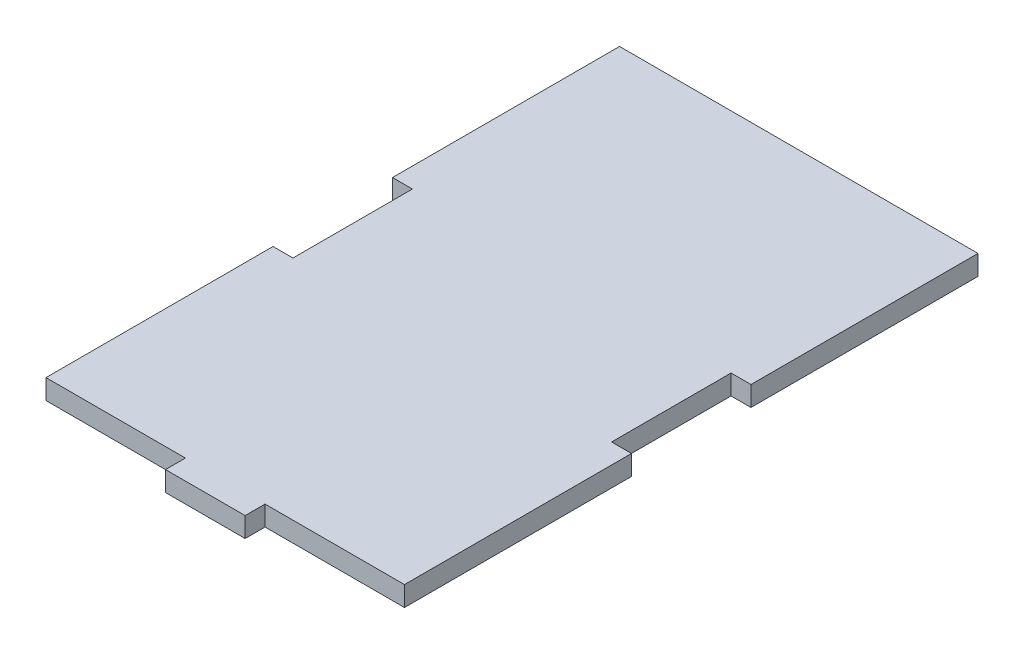
ISO-10303-21;
HEADER;
FILE_DESCRIPTION(('STEP AP214'),'2;1');
FILE_NAME('part.step','',(''),(''),'','','');
FILE_SCHEMA(('AUTOMOTIVE_DESIGN { 1 0 10303 214 1 1 1 1 }'));
ENDSEC;
DATA;
#1=APPLICATION_CONTEXT('core data for automotive mechanical design processes');
#2=APPLICATION_PROTOCOL_DEFINITION('international standard','automotive_design',2000,#1);
#3=PRODUCT_CONTEXT('',#1,'mechanical');
#4=PRODUCT('Part','Part','',(#3));
#5=PRODUCT_RELATED_PRODUCT_CATEGORY('part','',(#4));
#6=PRODUCT_DEFINITION_FORMATION('','',#4);
#7=PRODUCT_DEFINITION_CONTEXT('part definition',#1,'design');
#8=PRODUCT_DEFINITION('design','',#6,#7);
#9=PRODUCT_DEFINITION_SHAPE('','',#8);
#10=(LENGTH_UNIT() NAMED_UNIT(*) SI_UNIT(.MILLI.,.METRE.));
#11=(NAMED_UNIT(*) PLANE_ANGLE_UNIT() SI_UNIT($,.RADIAN.));
#12=(NAMED_UNIT(*) SI_UNIT($,.STERADIAN.) SOLID_ANGLE_UNIT());
#13=UNCERTAINTY_MEASURE_WITH_UNIT(LENGTH_MEASURE(1.E-05),#10,'distance_accuracy_value','');
#14=(GEOMETRIC_REPRESENTATION_CONTEXT(3) GLOBAL_UNCERTAINTY_ASSIGNED_CONTEXT((#13)) GLOBAL_UNIT_ASSIGNED_CONTEXT((#10,
#11,#12)) REPRESENTATION_CONTEXT('',''));
#15=CARTESIAN_POINT('',(0.,0.,0.));
#16=DIRECTION('',(0.,0.,1.));
#17=DIRECTION('',(1.,0.,0.));
#18=AXIS2_PLACEMENT_3D('',#15,#16,#17);
#19=CARTESIAN_POINT('',(10.,5.,0.));
#20=DIRECTION('',(1.,0.,0.));
#21=DIRECTION('',(0.,0.,-1.));
#22=AXIS2_PLACEMENT_3D('',#19,#20,#21);
#23=PLANE('',#22);
#24=DIRECTION('',(0.,0.,1.));
#25=VECTOR('',#24,1.);
#26=CARTESIAN_POINT('',(10.,0.,0.));
#27=LINE('',#26,#25);
#28=CARTESIAN_POINT('',(10.,0.,72.));
#29=VERTEX_POINT('',#28);
#30=CARTESIAN_POINT('',(10.,0.,77.));
#31=VERTEX_POINT('',#30);
#32=EDGE_CURVE('E177',#29,#31,#27,.T.);
#33=ORIENTED_EDGE('',*,*,#32,.F.);
#34=DIRECTION('',(0.,-1.,0.));
#35=VECTOR('',#34,1.);
#36=CARTESIAN_POINT('',(10.,5.,72.));
#37=LINE('',#36,#35);
#38=CARTESIAN_POINT('',(10.,5.,72.));
#39=VERTEX_POINT('',#38);
#40=EDGE_CURVE('E11',#39,#29,#37,.T.);
#41=ORIENTED_EDGE('',*,*,#40,.F.);
#42=DIRECTION('',(0.,0.,1.));
#43=VECTOR('',#42,1.);
#44=CARTESIAN_POINT('',(10.,5.,0.));
#45=LINE('',#44,#43);
#46=CARTESIAN_POINT('',(10.,5.,77.));
#47=VERTEX_POINT('',#46);
#48=EDGE_CURVE('E216',#39,#47,#45,.T.);
#49=ORIENTED_EDGE('',*,*,#48,.T.);
#50=DIRECTION('',(0.,-1.,0.));
#51=VECTOR('',#50,1.);
#52=CARTESIAN_POINT('',(10.,5.,77.));
#53=LINE('',#52,#51);
#54=EDGE_CURVE('E51',#47,#31,#53,.T.);
#55=ORIENTED_EDGE('',*,*,#54,.T.);
#56=EDGE_LOOP('',(#33,#41,#49,#55));
#57=FACE_BOUND('',#56,.T.);
#58=ADVANCED_FACE('F35',(#57),#23,.T.);
#59=CARTESIAN_POINT('',(0.,5.,72.));
#60=DIRECTION('',(0.,0.,-1.));
#61=DIRECTION('',(-1.,0.,0.));
#62=AXIS2_PLACEMENT_3D('',#59,#60,#61);
#63=PLANE('',#62);
#64=DIRECTION('',(1.,0.,0.));
#65=VECTOR('',#64,1.);
#66=CARTESIAN_POINT('',(0.,0.,72.));
#67=LINE('',#66,#65);
#68=CARTESIAN_POINT('',(45.,0.,72.));
#69=VERTEX_POINT('',#68);
#70=EDGE_CURVE('E179',#29,#69,#67,.T.);
#71=ORIENTED_EDGE('',*,*,#70,.T.);
#72=DIRECTION('',(0.,-1.,0.));
#73=VECTOR('',#72,1.);
#74=CARTESIAN_POINT('',(45.,5.,72.));
#75=LINE('',#74,#73);
#76=CARTESIAN_POINT('',(45.,5.,72.));
#77=VERTEX_POINT('',#76);
#78=EDGE_CURVE('E43',#77,#69,#75,.T.);
#79=ORIENTED_EDGE('',*,*,#78,.F.);
#80=DIRECTION('',(1.,0.,0.));
#81=VECTOR('',#80,1.);
#82=CARTESIAN_POINT('',(0.,5.,72.));
#83=LINE('',#82,#81);
#84=EDGE_CURVE('E264',#39,#77,#83,.T.);
#85=ORIENTED_EDGE('',*,*,#84,.F.);
#86=ORIENTED_EDGE('',*,*,#40,.T.);
#87=EDGE_LOOP('',(#71,#79,#85,#86));
#88=FACE_BOUND('',#87,.T.);
#89=ADVANCED_FACE('F252',(#88),#63,.F.);
#90=CARTESIAN_POINT('',(45.,5.,0.));
#91=DIRECTION('',(1.,0.,0.));
#92=DIRECTION('',(0.,0.,-1.));
#93=AXIS2_PLACEMENT_3D('',#90,#91,#92);
#94=PLANE('',#93);
#95=DIRECTION('',(0.,0.,1.));
#96=VECTOR('',#95,1.);
#97=CARTESIAN_POINT('',(45.,0.,0.));
#98=LINE('',#97,#96);
#99=CARTESIAN_POINT('',(45.,0.,15.));
#100=VERTEX_POINT('',#99);
#101=EDGE_CURVE('E182',#100,#69,#98,.T.);
#102=ORIENTED_EDGE('',*,*,#101,.F.);
#103=DIRECTION('',(0.,-1.,0.));
#104=VECTOR('',#103,1.);
#105=CARTESIAN_POINT('',(45.,5.,15.));
#106=LINE('',#105,#104);
#107=CARTESIAN_POINT('',(45.,5.,15.));
#108=VERTEX_POINT('',#107);
#109=EDGE_CURVE('E242',#108,#100,#106,.T.);
#110=ORIENTED_EDGE('',*,*,#109,.F.);
#111=DIRECTION('',(0.,0.,1.));
#112=VECTOR('',#111,1.);
#113=CARTESIAN_POINT('',(45.,5.,0.));
#114=LINE('',#113,#112);
#115=EDGE_CURVE('E249',#108,#77,#114,.T.);
#116=ORIENTED_EDGE('',*,*,#115,.T.);
#117=ORIENTED_EDGE('',*,*,#78,.T.);
#118=EDGE_LOOP('',(#102,#110,#116,#117));
#119=FACE_BOUND('',#118,.T.);
#120=ADVANCED_FACE('F247',(#119),#94,.T.);
#121=CARTESIAN_POINT('',(0.,5.,14.9999999999999));
#122=DIRECTION('',(0.,0.,-1.));
#123=DIRECTION('',(-1.,0.,0.));
#124=AXIS2_PLACEMENT_3D('',#121,#122,#123);
#125=PLANE('',#124);
#126=DIRECTION('',(1.,0.,0.));
#127=VECTOR('',#126,1.);
#128=CARTESIAN_POINT('',(0.,0.,14.9999999999999));
#129=LINE('',#128,#127);
#130=CARTESIAN_POINT('',(40.,0.,15.));
#131=VERTEX_POINT('',#130);
#132=EDGE_CURVE('E185',#131,#100,#129,.T.);
#133=ORIENTED_EDGE('',*,*,#132,.F.);
#134=DIRECTION('',(0.,-1.,0.));
#135=VECTOR('',#134,1.);
#136=CARTESIAN_POINT('',(40.,5.,15.));
#137=LINE('',#136,#135);
#138=CARTESIAN_POINT('',(40.,5.,15.));
#139=VERTEX_POINT('',#138);
#140=EDGE_CURVE('E240',#139,#131,#137,.T.);
#141=ORIENTED_EDGE('',*,*,#140,.F.);
#142=DIRECTION('',(1.,0.,0.));
#143=VECTOR('',#142,1.);
#144=CARTESIAN_POINT('',(0.,5.,14.9999999999999));
#145=LINE('',#144,#143);
#146=EDGE_CURVE('E261',#139,#108,#145,.T.);
#147=ORIENTED_EDGE('',*,*,#146,.T.);
#148=ORIENTED_EDGE('',*,*,#109,.T.);
#149=EDGE_LOOP('',(#133,#141,#147,#148));
#150=FACE_BOUND('',#149,.T.);
#151=ADVANCED_FACE('F258',(#150),#125,.T.);
#152=CARTESIAN_POINT('',(40.,5.,0.));
#153=DIRECTION('',(1.,0.,0.));
#154=DIRECTION('',(0.,0.,-1.));
#155=AXIS2_PLACEMENT_3D('',#152,#153,#154);
#156=PLANE('',#155);
#157=DIRECTION('',(0.,0.,1.));
#158=VECTOR('',#157,1.);
#159=CARTESIAN_POINT('',(40.,0.,0.));
#160=LINE('',#159,#158);
#161=CARTESIAN_POINT('',(40.,0.,-15.));
#162=VERTEX_POINT('',#161);
#163=EDGE_CURVE('E188',#162,#131,#160,.T.);
#164=ORIENTED_EDGE('',*,*,#163,.F.);
#165=DIRECTION('',(0.,-1.,0.));
#166=VECTOR('',#165,1.);
#167=CARTESIAN_POINT('',(40.,5.,-15.));
#168=LINE('',#167,#166);
#169=CARTESIAN_POINT('',(40.,5.,-15.));
#170=VERTEX_POINT('',#169);
#171=EDGE_CURVE('E238',#170,#162,#168,.T.);
#172=ORIENTED_EDGE('',*,*,#171,.F.);
#173=DIRECTION('',(0.,0.,1.));
#174=VECTOR('',#173,1.);
#175=CARTESIAN_POINT('',(40.,5.,0.));
#176=LINE('',#175,#174);
#177=EDGE_CURVE('E266',#170,#139,#176,.T.);
#178=ORIENTED_EDGE('',*,*,#177,.T.);
#179=ORIENTED_EDGE('',*,*,#140,.T.);
#180=EDGE_LOOP('',(#164,#172,#178,#179));
#181=FACE_BOUND('',#180,.T.);
#182=ADVANCED_FACE('F319',(#181),#156,.T.);
#183=CARTESIAN_POINT('',(0.,5.,-15.0000000000001));
#184=DIRECTION('',(0.,0.,1.));
#185=DIRECTION('',(1.,0.,0.));
#186=AXIS2_PLACEMENT_3D('',#183,#184,#185);
#187=PLANE('',#186);
#188=DIRECTION('',(-1.,0.,0.));
#189=VECTOR('',#188,1.);
#190=CARTESIAN_POINT('',(0.,0.,-15.0000000000001));
#191=LINE('',#190,#189);
#192=CARTESIAN_POINT('',(45.,0.,-15.));
#193=VERTEX_POINT('',#192);
#194=EDGE_CURVE('E191',#193,#162,#191,.T.);
#195=ORIENTED_EDGE('',*,*,#194,.F.);
#196=DIRECTION('',(0.,-1.,0.));
#197=VECTOR('',#196,1.);
#198=CARTESIAN_POINT('',(45.,5.,-15.));
#199=LINE('',#198,#197);
#200=CARTESIAN_POINT('',(45.,5.,-15.));
#201=VERTEX_POINT('',#200);
#202=EDGE_CURVE('E236',#201,#193,#199,.T.);
#203=ORIENTED_EDGE('',*,*,#202,.F.);
#204=DIRECTION('',(-1.,0.,0.));
#205=VECTOR('',#204,1.);
#206=CARTESIAN_POINT('',(0.,5.,-15.0000000000001));
#207=LINE('',#206,#205);
#208=EDGE_CURVE('E272',#201,#170,#207,.T.);
#209=ORIENTED_EDGE('',*,*,#208,.T.);
#210=ORIENTED_EDGE('',*,*,#171,.T.);
#211=EDGE_LOOP('',(#195,#203,#209,#210));
#212=FACE_BOUND('',#211,.T.);
#213=ADVANCED_FACE('F322',(#212),#187,.T.);
#214=CARTESIAN_POINT('',(45.,5.,0.));
#215=DIRECTION('',(1.,0.,0.));
#216=DIRECTION('',(0.,0.,-1.));
#217=AXIS2_PLACEMENT_3D('',#214,#215,#216);
#218=PLANE('',#217);
#219=DIRECTION('',(0.,0.,1.));
#220=VECTOR('',#219,1.);
#221=CARTESIAN_POINT('',(45.,0.,0.));
#222=LINE('',#221,#220);
#223=CARTESIAN_POINT('',(45.,0.,-72.));
#224=VERTEX_POINT('',#223);
#225=EDGE_CURVE('E194',#224,#193,#222,.T.);
#226=ORIENTED_EDGE('',*,*,#225,.F.);
#227=DIRECTION('',(0.,-1.,0.));
#228=VECTOR('',#227,1.);
#229=CARTESIAN_POINT('',(45.,5.,-72.));
#230=LINE('',#229,#228);
#231=CARTESIAN_POINT('',(45.,5.,-72.));
#232=VERTEX_POINT('',#231);
#233=EDGE_CURVE('E234',#232,#224,#230,.T.);
#234=ORIENTED_EDGE('',*,*,#233,.F.);
#235=DIRECTION('',(0.,0.,1.));
#236=VECTOR('',#235,1.);
#237=CARTESIAN_POINT('',(45.,5.,0.));
#238=LINE('',#237,#236);
#239=EDGE_CURVE('E275',#232,#201,#238,.T.);
#240=ORIENTED_EDGE('',*,*,#239,.T.);
#241=ORIENTED_EDGE('',*,*,#202,.T.);
#242=EDGE_LOOP('',(#226,#234,#240,#241));
#243=FACE_BOUND('',#242,.T.);
#244=ADVANCED_FACE('F326',(#243),#218,.T.);
#245=CARTESIAN_POINT('',(0.,5.,-72.));
#246=DIRECTION('',(0.,0.,-1.));
#247=DIRECTION('',(-1.,0.,0.));
#248=AXIS2_PLACEMENT_3D('',#245,#246,#247);
#249=PLANE('',#248);
#250=DIRECTION('',(1.,0.,0.));
#251=VECTOR('',#250,1.);
#252=CARTESIAN_POINT('',(0.,0.,-72.));
#253=LINE('',#252,#251);
#254=CARTESIAN_POINT('',(-45.,0.,-72.));
#255=VERTEX_POINT('',#254);
#256=EDGE_CURVE('E197',#255,#224,#253,.T.);
#257=ORIENTED_EDGE('',*,*,#256,.F.);
#258=DIRECTION('',(0.,-1.,0.));
#259=VECTOR('',#258,1.);
#260=CARTESIAN_POINT('',(-45.,5.,-72.));
#261=LINE('',#260,#259);
#262=CARTESIAN_POINT('',(-45.,5.,-72.));
#263=VERTEX_POINT('',#262);
#264=EDGE_CURVE('E232',#263,#255,#261,.T.);
#265=ORIENTED_EDGE('',*,*,#264,.F.);
#266=DIRECTION('',(1.,0.,0.));
#267=VECTOR('',#266,1.);
#268=CARTESIAN_POINT('',(0.,5.,-72.));
#269=LINE('',#268,#267);
#270=EDGE_CURVE('E278',#263,#232,#269,.T.);
#271=ORIENTED_EDGE('',*,*,#270,.T.);
#272=ORIENTED_EDGE('',*,*,#233,.T.);
#273=EDGE_LOOP('',(#257,#265,#271,#272));
#274=FACE_BOUND('',#273,.T.);
#275=ADVANCED_FACE('F330',(#274),#249,.T.);
#276=CARTESIAN_POINT('',(-45.,5.,0.));
#277=DIRECTION('',(1.,0.,0.));
#278=DIRECTION('',(0.,0.,-1.));
#279=AXIS2_PLACEMENT_3D('',#276,#277,#278);
#280=PLANE('',#279);
#281=DIRECTION('',(0.,0.,1.));
#282=VECTOR('',#281,1.);
#283=CARTESIAN_POINT('',(-45.,0.,0.));
#284=LINE('',#283,#282);
#285=CARTESIAN_POINT('',(-45.,0.,-15.));
#286=VERTEX_POINT('',#285);
#287=EDGE_CURVE('E200',#255,#286,#284,.T.);
#288=ORIENTED_EDGE('',*,*,#287,.T.);
#289=DIRECTION('',(0.,-1.,0.));
#290=VECTOR('',#289,1.);
#291=CARTESIAN_POINT('',(-45.,5.,-15.));
#292=LINE('',#291,#290);
#293=CARTESIAN_POINT('',(-45.,5.,-15.));
#294=VERTEX_POINT('',#293);
#295=EDGE_CURVE('E229',#294,#286,#292,.T.);
#296=ORIENTED_EDGE('',*,*,#295,.F.);
#297=DIRECTION('',(0.,0.,1.));
#298=VECTOR('',#297,1.);
#299=CARTESIAN_POINT('',(-45.,5.,0.));
#300=LINE('',#299,#298);
#301=EDGE_CURVE('E281',#263,#294,#300,.T.);
#302=ORIENTED_EDGE('',*,*,#301,.F.);
#303=ORIENTED_EDGE('',*,*,#264,.T.);
#304=EDGE_LOOP('',(#288,#296,#302,#303));
#305=FACE_BOUND('',#304,.T.);
#306=ADVANCED_FACE('F334',(#305),#280,.F.);
#307=CARTESIAN_POINT('',(0.,5.,-15.0000000000001));
#308=DIRECTION('',(0.,0.,-1.));
#309=DIRECTION('',(-1.,0.,0.));
#310=AXIS2_PLACEMENT_3D('',#307,#308,#309);
#311=PLANE('',#310);
#312=DIRECTION('',(1.,0.,0.));
#313=VECTOR('',#312,1.);
#314=CARTESIAN_POINT('',(0.,0.,-15.0000000000001));
#315=LINE('',#314,#313);
#316=CARTESIAN_POINT('',(-40.,0.,-15.));
#317=VERTEX_POINT('',#316);
#318=EDGE_CURVE('E202',#286,#317,#315,.T.);
#319=ORIENTED_EDGE('',*,*,#318,.T.);
#320=DIRECTION('',(0.,-1.,0.));
#321=VECTOR('',#320,1.);
#322=CARTESIAN_POINT('',(-40.,5.,-15.));
#323=LINE('',#322,#321);
#324=CARTESIAN_POINT('',(-40.,5.,-15.));
#325=VERTEX_POINT('',#324);
#326=EDGE_CURVE('E226',#325,#317,#323,.T.);
#327=ORIENTED_EDGE('',*,*,#326,.F.);
#328=DIRECTION('',(1.,0.,0.));
#329=VECTOR('',#328,1.);
#330=CARTESIAN_POINT('',(0.,5.,-15.0000000000001));
#331=LINE('',#330,#329);
#332=EDGE_CURVE('E283',#294,#325,#331,.T.);
#333=ORIENTED_EDGE('',*,*,#332,.F.);
#334=ORIENTED_EDGE('',*,*,#295,.T.);
#335=EDGE_LOOP('',(#319,#327,#333,#334));
#336=FACE_BOUND('',#335,.T.);
#337=ADVANCED_FACE('F338',(#336),#311,.F.);
#338=CARTESIAN_POINT('',(-40.,5.,0.));
#339=DIRECTION('',(1.,0.,0.));
#340=DIRECTION('',(0.,0.,-1.));
#341=AXIS2_PLACEMENT_3D('',#338,#339,#340);
#342=PLANE('',#341);
#343=DIRECTION('',(0.,0.,1.));
#344=VECTOR('',#343,1.);
#345=CARTESIAN_POINT('',(-40.,0.,0.));
#346=LINE('',#345,#344);
#347=CARTESIAN_POINT('',(-40.,0.,15.));
#348=VERTEX_POINT('',#347);
#349=EDGE_CURVE('E204',#317,#348,#346,.T.);
#350=ORIENTED_EDGE('',*,*,#349,.T.);
#351=DIRECTION('',(0.,-1.,0.));
#352=VECTOR('',#351,1.);
#353=CARTESIAN_POINT('',(-40.,5.,15.));
#354=LINE('',#353,#352);
#355=CARTESIAN_POINT('',(-40.,5.,15.));
#356=VERTEX_POINT('',#355);
#357=EDGE_CURVE('E223',#356,#348,#354,.T.);
#358=ORIENTED_EDGE('',*,*,#357,.F.);
#359=DIRECTION('',(0.,0.,1.));
#360=VECTOR('',#359,1.);
#361=CARTESIAN_POINT('',(-40.,5.,0.));
#362=LINE('',#361,#360);
#363=EDGE_CURVE('E285',#325,#356,#362,.T.);
#364=ORIENTED_EDGE('',*,*,#363,.F.);
#365=ORIENTED_EDGE('',*,*,#326,.T.);
#366=EDGE_LOOP('',(#350,#358,#364,#365));
#367=FACE_BOUND('',#366,.T.);
#368=ADVANCED_FACE('F342',(#367),#342,.F.);
#369=CARTESIAN_POINT('',(0.,5.,14.9999999999999));
#370=DIRECTION('',(0.,0.,1.));
#371=DIRECTION('',(1.,0.,0.));
#372=AXIS2_PLACEMENT_3D('',#369,#370,#371);
#373=PLANE('',#372);
#374=DIRECTION('',(-1.,0.,0.));
#375=VECTOR('',#374,1.);
#376=CARTESIAN_POINT('',(0.,0.,14.9999999999999));
#377=LINE('',#376,#375);
#378=CARTESIAN_POINT('',(-45.,0.,15.));
#379=VERTEX_POINT('',#378);
#380=EDGE_CURVE('E206',#348,#379,#377,.T.);
#381=ORIENTED_EDGE('',*,*,#380,.T.);
#382=DIRECTION('',(0.,-1.,0.));
#383=VECTOR('',#382,1.);
#384=CARTESIAN_POINT('',(-45.,5.,15.));
#385=LINE('',#384,#383);
#386=CARTESIAN_POINT('',(-45.,5.,15.));
#387=VERTEX_POINT('',#386);
#388=EDGE_CURVE('E220',#387,#379,#385,.T.);
#389=ORIENTED_EDGE('',*,*,#388,.F.);
#390=DIRECTION('',(-1.,0.,0.));
#391=VECTOR('',#390,1.);
#392=CARTESIAN_POINT('',(0.,5.,14.9999999999999));
#393=LINE('',#392,#391);
#394=EDGE_CURVE('E287',#356,#387,#393,.T.);
#395=ORIENTED_EDGE('',*,*,#394,.F.);
#396=ORIENTED_EDGE('',*,*,#357,.T.);
#397=EDGE_LOOP('',(#381,#389,#395,#396));
#398=FACE_BOUND('',#397,.T.);
#399=ADVANCED_FACE('F293',(#398),#373,.F.);
#400=CARTESIAN_POINT('',(-45.,5.,0.));
#401=DIRECTION('',(1.,0.,0.));
#402=DIRECTION('',(0.,0.,-1.));
#403=AXIS2_PLACEMENT_3D('',#400,#401,#402);
#404=PLANE('',#403);
#405=DIRECTION('',(0.,0.,1.));
#406=VECTOR('',#405,1.);
#407=CARTESIAN_POINT('',(-45.,0.,0.));
#408=LINE('',#407,#406);
#409=CARTESIAN_POINT('',(-45.,0.,72.));
#410=VERTEX_POINT('',#409);
#411=EDGE_CURVE('E208',#379,#410,#408,.T.);
#412=ORIENTED_EDGE('',*,*,#411,.T.);
#413=DIRECTION('',(0.,-1.,0.));
#414=VECTOR('',#413,1.);
#415=CARTESIAN_POINT('',(-45.,5.,72.));
#416=LINE('',#415,#414);
#417=CARTESIAN_POINT('',(-45.,5.,72.));
#418=VERTEX_POINT('',#417);
#419=EDGE_CURVE('E169',#418,#410,#416,.T.);
#420=ORIENTED_EDGE('',*,*,#419,.F.);
#421=DIRECTION('',(0.,0.,1.));
#422=VECTOR('',#421,1.);
#423=CARTESIAN_POINT('',(-45.,5.,0.));
#424=LINE('',#423,#422);
#425=EDGE_CURVE('E157',#387,#418,#424,.T.);
#426=ORIENTED_EDGE('',*,*,#425,.F.);
#427=ORIENTED_EDGE('',*,*,#388,.T.);
#428=EDGE_LOOP('',(#412,#420,#426,#427));
#429=FACE_BOUND('',#428,.T.);
#430=ADVANCED_FACE('F297',(#429),#404,.F.);
#431=CARTESIAN_POINT('',(0.,5.,72.));
#432=DIRECTION('',(0.,0.,-1.));
#433=DIRECTION('',(-1.,0.,0.));
#434=AXIS2_PLACEMENT_3D('',#431,#432,#433);
#435=PLANE('',#434);
#436=DIRECTION('',(1.,0.,0.));
#437=VECTOR('',#436,1.);
#438=CARTESIAN_POINT('',(0.,0.,72.));
#439=LINE('',#438,#437);
#440=CARTESIAN_POINT('',(-9.99999999999999,0.,72.));
#441=VERTEX_POINT('',#440);
#442=EDGE_CURVE('E166',#410,#441,#439,.T.);
#443=ORIENTED_EDGE('',*,*,#442,.T.);
#444=DIRECTION('',(0.,-1.,0.));
#445=VECTOR('',#444,1.);
#446=CARTESIAN_POINT('',(-9.99999999999999,5.,72.));
#447=LINE('',#446,#445);
#448=CARTESIAN_POINT('',(-9.99999999999999,5.,72.));
#449=VERTEX_POINT('',#448);
#450=EDGE_CURVE('E163',#449,#441,#447,.T.);
#451=ORIENTED_EDGE('',*,*,#450,.F.);
#452=DIRECTION('',(1.,0.,0.));
#453=VECTOR('',#452,1.);
#454=CARTESIAN_POINT('',(0.,5.,72.));
#455=LINE('',#454,#453);
#456=EDGE_CURVE('E149',#418,#449,#455,.T.);
#457=ORIENTED_EDGE('',*,*,#456,.F.);
#458=ORIENTED_EDGE('',*,*,#419,.T.);
#459=EDGE_LOOP('',(#443,#451,#457,#458));
#460=FACE_BOUND('',#459,.T.);
#461=ADVANCED_FACE('F164',(#460),#435,.F.);
#462=CARTESIAN_POINT('',(-9.99999999999999,5.,0.));
#463=DIRECTION('',(-1.,0.,0.));
#464=DIRECTION('',(0.,0.,1.));
#465=AXIS2_PLACEMENT_3D('',#462,#463,#464);
#466=PLANE('',#465);
#467=DIRECTION('',(0.,0.,-1.));
#468=VECTOR('',#467,1.);
#469=CARTESIAN_POINT('',(-9.99999999999999,0.,0.));
#470=LINE('',#469,#468);
#471=CARTESIAN_POINT('',(-9.99999999999999,0.,77.));
#472=VERTEX_POINT('',#471);
#473=EDGE_CURVE('E211',#472,#441,#470,.T.);
#474=ORIENTED_EDGE('',*,*,#473,.F.);
#475=DIRECTION('',(0.,-1.,0.));
#476=VECTOR('',#475,1.);
#477=CARTESIAN_POINT('',(-9.99999999999999,5.,77.));
#478=LINE('',#477,#476);
#479=CARTESIAN_POINT('',(-9.99999999999999,5.,77.));
#480=VERTEX_POINT('',#479);
#481=EDGE_CURVE('E100',#480,#472,#478,.T.);
#482=ORIENTED_EDGE('',*,*,#481,.F.);
#483=DIRECTION('',(0.,0.,-1.));
#484=VECTOR('',#483,1.);
#485=CARTESIAN_POINT('',(-9.99999999999999,5.,0.));
#486=LINE('',#485,#484);
#487=EDGE_CURVE('E155',#480,#449,#486,.T.);
#488=ORIENTED_EDGE('',*,*,#487,.T.);
#489=ORIENTED_EDGE('',*,*,#450,.T.);
#490=EDGE_LOOP('',(#474,#482,#488,#489));
#491=FACE_BOUND('',#490,.T.);
#492=ADVANCED_FACE('F171',(#491),#466,.T.);
#493=CARTESIAN_POINT('',(0.,5.,77.));
#494=DIRECTION('',(0.,0.,1.));
#495=DIRECTION('',(1.,0.,0.));
#496=AXIS2_PLACEMENT_3D('',#493,#494,#495);
#497=PLANE('',#496);
#498=DIRECTION('',(-1.,0.,0.));
#499=VECTOR('',#498,1.);
#500=CARTESIAN_POINT('',(0.,0.,77.));
#501=LINE('',#500,#499);
#502=EDGE_CURVE('E213',#31,#472,#501,.T.);
#503=ORIENTED_EDGE('',*,*,#502,.F.);
#504=ORIENTED_EDGE('',*,*,#54,.F.);
#505=DIRECTION('',(-1.,0.,0.));
#506=VECTOR('',#505,1.);
#507=CARTESIAN_POINT('',(0.,5.,77.));
#508=LINE('',#507,#506);
#509=EDGE_CURVE('E172',#47,#480,#508,.T.);
#510=ORIENTED_EDGE('',*,*,#509,.T.);
#511=ORIENTED_EDGE('',*,*,#481,.T.);
#512=EDGE_LOOP('',(#503,#504,#510,#511));
#513=FACE_BOUND('',#512,.T.);
#514=ADVANCED_FACE('F298',(#513),#497,.T.);
#515=CARTESIAN_POINT('',(0.,5.,0.));
#516=DIRECTION('',(0.,1.,0.));
#517=DIRECTION('',(0.,0.,1.));
#518=AXIS2_PLACEMENT_3D('',#515,#516,#517);
#519=PLANE('',#518);
#520=ORIENTED_EDGE('',*,*,#48,.F.);
#521=ORIENTED_EDGE('',*,*,#84,.T.);
#522=ORIENTED_EDGE('',*,*,#115,.F.);
#523=ORIENTED_EDGE('',*,*,#146,.F.);
#524=ORIENTED_EDGE('',*,*,#177,.F.);
#525=ORIENTED_EDGE('',*,*,#208,.F.);
#526=ORIENTED_EDGE('',*,*,#239,.F.);
#527=ORIENTED_EDGE('',*,*,#270,.F.);
#528=ORIENTED_EDGE('',*,*,#301,.T.);
#529=ORIENTED_EDGE('',*,*,#332,.T.);
#530=ORIENTED_EDGE('',*,*,#363,.T.);
#531=ORIENTED_EDGE('',*,*,#394,.T.);
#532=ORIENTED_EDGE('',*,*,#425,.T.);
#533=ORIENTED_EDGE('',*,*,#456,.T.);
#534=ORIENTED_EDGE('',*,*,#487,.F.);
#535=ORIENTED_EDGE('',*,*,#509,.F.);
#536=EDGE_LOOP('',(#520,#521,#522,#523,#524,#525,#526,#527,#528,#529,#530,#531,#532,#533,#534,#535));
#537=FACE_BOUND('',#536,.T.);
#538=ADVANCED_FACE('F152',(#537),#519,.T.);
#539=CARTESIAN_POINT('',(0.,0.,0.));
#540=DIRECTION('',(0.,1.,0.));
#541=DIRECTION('',(0.,0.,1.));
#542=AXIS2_PLACEMENT_3D('',#539,#540,#541);
#543=PLANE('',#542);
#544=ORIENTED_EDGE('',*,*,#32,.T.);
#545=ORIENTED_EDGE('',*,*,#502,.T.);
#546=ORIENTED_EDGE('',*,*,#473,.T.);
#547=ORIENTED_EDGE('',*,*,#442,.F.);
#548=ORIENTED_EDGE('',*,*,#411,.F.);
#549=ORIENTED_EDGE('',*,*,#380,.F.);
#550=ORIENTED_EDGE('',*,*,#349,.F.);
#551=ORIENTED_EDGE('',*,*,#318,.F.);
#552=ORIENTED_EDGE('',*,*,#287,.F.);
#553=ORIENTED_EDGE('',*,*,#256,.T.);
#554=ORIENTED_EDGE('',*,*,#225,.T.);
#555=ORIENTED_EDGE('',*,*,#194,.T.);
#556=ORIENTED_EDGE('',*,*,#163,.T.);
#557=ORIENTED_EDGE('',*,*,#132,.T.);
#558=ORIENTED_EDGE('',*,*,#101,.T.);
#559=ORIENTED_EDGE('',*,*,#70,.F.);
#560=EDGE_LOOP('',(#544,#545,#546,#547,#548,#549,#550,#551,#552,#553,#554,#555,#556,#557,#558,#559));
#561=FACE_BOUND('',#560,.T.);
#562=ADVANCED_FACE('F254',(#561),#543,.F.);
#563=CLOSED_SHELL('',(#58,#89,#120,#151,#182,#213,#244,#275,#306,#337,#368,#399,#430,#461,#492,
#514,#538,#562));
#564=MANIFOLD_SOLID_BREP('B2',#563);
#565=ADVANCED_BREP_SHAPE_REPRESENTATION('',(#18,#564),#14);
#566=SHAPE_DEFINITION_REPRESENTATION(#9,#565);
ENDSEC;
END-ISO-10303-21;
